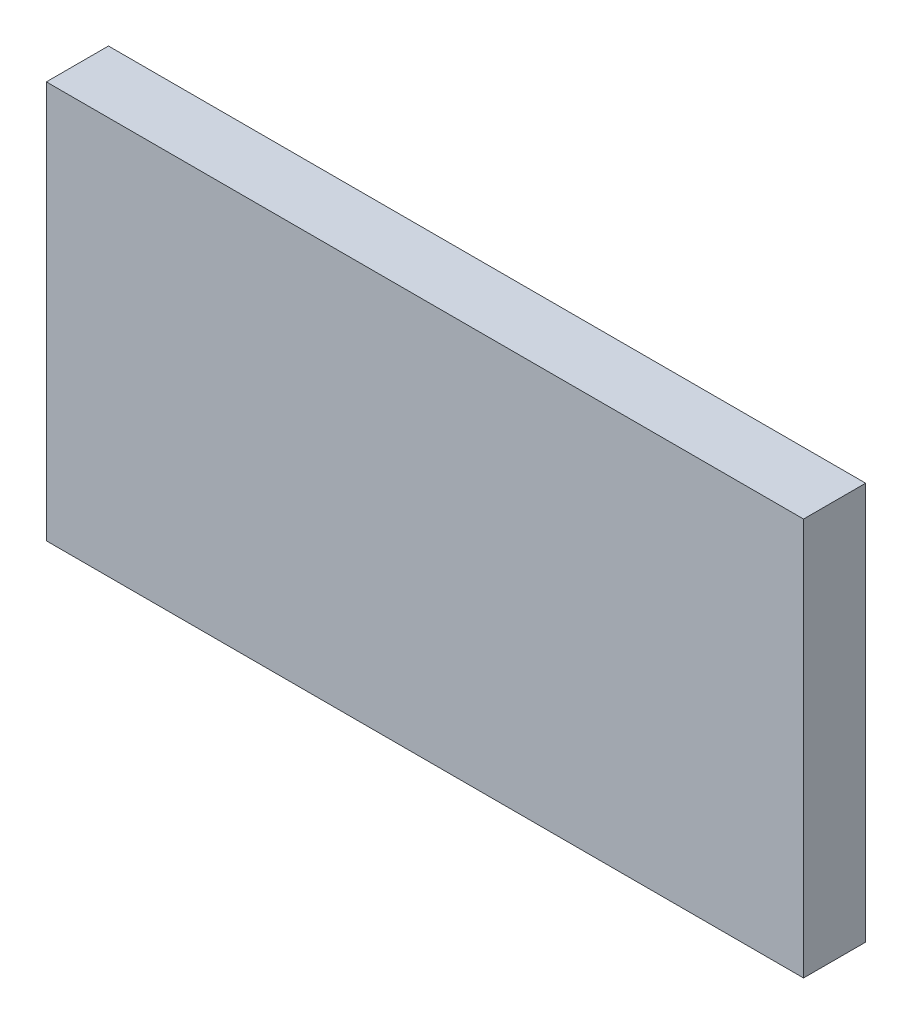
ISO-10303-21;
HEADER;
FILE_DESCRIPTION(('STEP AP214'),'2;1');
FILE_NAME('part.step','',(''),(''),'','','');
FILE_SCHEMA(('AUTOMOTIVE_DESIGN { 1 0 10303 214 1 1 1 1 }'));
ENDSEC;
DATA;
#1=APPLICATION_CONTEXT('core data for automotive mechanical design processes');
#2=APPLICATION_PROTOCOL_DEFINITION('international standard','automotive_design',2000,#1);
#3=PRODUCT_CONTEXT('',#1,'mechanical');
#4=PRODUCT('Part','Part','',(#3));
#5=PRODUCT_RELATED_PRODUCT_CATEGORY('part','',(#4));
#6=PRODUCT_DEFINITION_FORMATION('','',#4);
#7=PRODUCT_DEFINITION_CONTEXT('part definition',#1,'design');
#8=PRODUCT_DEFINITION('design','',#6,#7);
#9=PRODUCT_DEFINITION_SHAPE('','',#8);
#10=(LENGTH_UNIT() NAMED_UNIT(*) SI_UNIT(.MILLI.,.METRE.));
#11=(NAMED_UNIT(*) PLANE_ANGLE_UNIT() SI_UNIT($,.RADIAN.));
#12=(NAMED_UNIT(*) SI_UNIT($,.STERADIAN.) SOLID_ANGLE_UNIT());
#13=UNCERTAINTY_MEASURE_WITH_UNIT(LENGTH_MEASURE(1.E-05),#10,'distance_accuracy_value','');
#14=(GEOMETRIC_REPRESENTATION_CONTEXT(3) GLOBAL_UNCERTAINTY_ASSIGNED_CONTEXT((#13)) GLOBAL_UNIT_ASSIGNED_CONTEXT((#10,
#11,#12)) REPRESENTATION_CONTEXT('',''));
#15=CARTESIAN_POINT('',(0.,0.,0.));
#16=DIRECTION('',(0.,0.,1.));
#17=DIRECTION('',(1.,0.,0.));
#18=AXIS2_PLACEMENT_3D('',#15,#16,#17);
#19=CARTESIAN_POINT('',(60.96,0.,-5.));
#20=DIRECTION('',(0.,-1.,0.));
#21=DIRECTION('',(1.,0.,0.));
#22=AXIS2_PLACEMENT_3D('',#19,#20,#21);
#23=PLANE('',#22);
#24=DIRECTION('',(1.,0.,0.));
#25=VECTOR('',#24,1.);
#26=CARTESIAN_POINT('',(60.96,0.,0.));
#27=LINE('',#26,#25);
#28=CARTESIAN_POINT('',(0.,0.,0.));
#29=VERTEX_POINT('',#28);
#30=CARTESIAN_POINT('',(60.96,0.,0.));
#31=VERTEX_POINT('',#30);
#32=EDGE_CURVE('E109',#29,#31,#27,.T.);
#33=ORIENTED_EDGE('',*,*,#32,.F.);
#34=DIRECTION('',(0.,0.,1.));
#35=VECTOR('',#34,1.);
#36=CARTESIAN_POINT('',(0.,0.,-5.));
#37=LINE('',#36,#35);
#38=CARTESIAN_POINT('',(0.,0.,-5.));
#39=VERTEX_POINT('',#38);
#40=EDGE_CURVE('E11',#39,#29,#37,.T.);
#41=ORIENTED_EDGE('',*,*,#40,.F.);
#42=DIRECTION('',(1.,0.,0.));
#43=VECTOR('',#42,1.);
#44=CARTESIAN_POINT('',(60.96,0.,-5.));
#45=LINE('',#44,#43);
#46=CARTESIAN_POINT('',(60.96,0.,-5.));
#47=VERTEX_POINT('',#46);
#48=EDGE_CURVE('E100',#39,#47,#45,.T.);
#49=ORIENTED_EDGE('',*,*,#48,.T.);
#50=DIRECTION('',(0.,0.,1.));
#51=VECTOR('',#50,1.);
#52=CARTESIAN_POINT('',(60.96,0.,-5.));
#53=LINE('',#52,#51);
#54=EDGE_CURVE('E41',#47,#31,#53,.T.);
#55=ORIENTED_EDGE('',*,*,#54,.T.);
#56=EDGE_LOOP('',(#33,#41,#49,#55));
#57=FACE_BOUND('',#56,.T.);
#58=ADVANCED_FACE('F38',(#57),#23,.T.);
#59=CARTESIAN_POINT('',(0.,0.,-5.));
#60=DIRECTION('',(-1.,0.,0.));
#61=DIRECTION('',(0.,0.,1.));
#62=AXIS2_PLACEMENT_3D('',#59,#60,#61);
#63=PLANE('',#62);
#64=DIRECTION('',(0.,-1.,0.));
#65=VECTOR('',#64,1.);
#66=CARTESIAN_POINT('',(0.,0.,0.));
#67=LINE('',#66,#65);
#68=CARTESIAN_POINT('',(0.,32.,0.));
#69=VERTEX_POINT('',#68);
#70=EDGE_CURVE('E104',#69,#29,#67,.T.);
#71=ORIENTED_EDGE('',*,*,#70,.F.);
#72=DIRECTION('',(0.,0.,1.));
#73=VECTOR('',#72,1.);
#74=CARTESIAN_POINT('',(0.,32.,-5.));
#75=LINE('',#74,#73);
#76=CARTESIAN_POINT('',(0.,32.,-5.));
#77=VERTEX_POINT('',#76);
#78=EDGE_CURVE('E48',#77,#69,#75,.T.);
#79=ORIENTED_EDGE('',*,*,#78,.F.);
#80=DIRECTION('',(0.,-1.,0.));
#81=VECTOR('',#80,1.);
#82=CARTESIAN_POINT('',(0.,0.,-5.));
#83=LINE('',#82,#81);
#84=EDGE_CURVE('E95',#77,#39,#83,.T.);
#85=ORIENTED_EDGE('',*,*,#84,.T.);
#86=ORIENTED_EDGE('',*,*,#40,.T.);
#87=EDGE_LOOP('',(#71,#79,#85,#86));
#88=FACE_BOUND('',#87,.T.);
#89=ADVANCED_FACE('F124',(#88),#63,.T.);
#90=CARTESIAN_POINT('',(0.,32.,-5.));
#91=DIRECTION('',(0.,1.,0.));
#92=DIRECTION('',(0.,0.,1.));
#93=AXIS2_PLACEMENT_3D('',#90,#91,#92);
#94=PLANE('',#93);
#95=DIRECTION('',(-1.,0.,0.));
#96=VECTOR('',#95,1.);
#97=CARTESIAN_POINT('',(0.,32.,0.));
#98=LINE('',#97,#96);
#99=CARTESIAN_POINT('',(60.96,32.,0.));
#100=VERTEX_POINT('',#99);
#101=EDGE_CURVE('E89',#100,#69,#98,.T.);
#102=ORIENTED_EDGE('',*,*,#101,.F.);
#103=DIRECTION('',(0.,0.,1.));
#104=VECTOR('',#103,1.);
#105=CARTESIAN_POINT('',(60.96,32.,-5.));
#106=LINE('',#105,#104);
#107=CARTESIAN_POINT('',(60.96,32.,-5.));
#108=VERTEX_POINT('',#107);
#109=EDGE_CURVE('E84',#108,#100,#106,.T.);
#110=ORIENTED_EDGE('',*,*,#109,.F.);
#111=DIRECTION('',(-1.,0.,0.));
#112=VECTOR('',#111,1.);
#113=CARTESIAN_POINT('',(0.,32.,-5.));
#114=LINE('',#113,#112);
#115=EDGE_CURVE('E87',#108,#77,#114,.T.);
#116=ORIENTED_EDGE('',*,*,#115,.T.);
#117=ORIENTED_EDGE('',*,*,#78,.T.);
#118=EDGE_LOOP('',(#102,#110,#116,#117));
#119=FACE_BOUND('',#118,.T.);
#120=ADVANCED_FACE('F86',(#119),#94,.T.);
#121=CARTESIAN_POINT('',(60.96,32.,-5.));
#122=DIRECTION('',(1.,0.,0.));
#123=DIRECTION('',(0.,1.,0.));
#124=AXIS2_PLACEMENT_3D('',#121,#122,#123);
#125=PLANE('',#124);
#126=DIRECTION('',(0.,1.,0.));
#127=VECTOR('',#126,1.);
#128=CARTESIAN_POINT('',(60.96,32.,0.));
#129=LINE('',#128,#127);
#130=EDGE_CURVE('E113',#31,#100,#129,.T.);
#131=ORIENTED_EDGE('',*,*,#130,.F.);
#132=ORIENTED_EDGE('',*,*,#54,.F.);
#133=DIRECTION('',(0.,1.,0.));
#134=VECTOR('',#133,1.);
#135=CARTESIAN_POINT('',(60.96,32.,-5.));
#136=LINE('',#135,#134);
#137=EDGE_CURVE('E94',#47,#108,#136,.T.);
#138=ORIENTED_EDGE('',*,*,#137,.T.);
#139=ORIENTED_EDGE('',*,*,#109,.T.);
#140=EDGE_LOOP('',(#131,#132,#138,#139));
#141=FACE_BOUND('',#140,.T.);
#142=ADVANCED_FACE('F98',(#141),#125,.T.);
#143=CARTESIAN_POINT('',(0.,0.,-5.));
#144=DIRECTION('',(0.,0.,-1.));
#145=DIRECTION('',(-1.,0.,0.));
#146=AXIS2_PLACEMENT_3D('',#143,#144,#145);
#147=PLANE('',#146);
#148=ORIENTED_EDGE('',*,*,#48,.F.);
#149=ORIENTED_EDGE('',*,*,#84,.F.);
#150=ORIENTED_EDGE('',*,*,#115,.F.);
#151=ORIENTED_EDGE('',*,*,#137,.F.);
#152=EDGE_LOOP('',(#148,#149,#150,#151));
#153=FACE_BOUND('',#152,.T.);
#154=ADVANCED_FACE('F93',(#153),#147,.T.);
#155=CARTESIAN_POINT('',(0.,0.,0.));
#156=DIRECTION('',(0.,0.,-1.));
#157=DIRECTION('',(-1.,0.,0.));
#158=AXIS2_PLACEMENT_3D('',#155,#156,#157);
#159=PLANE('',#158);
#160=ORIENTED_EDGE('',*,*,#32,.T.);
#161=ORIENTED_EDGE('',*,*,#130,.T.);
#162=ORIENTED_EDGE('',*,*,#101,.T.);
#163=ORIENTED_EDGE('',*,*,#70,.T.);
#164=EDGE_LOOP('',(#160,#161,#162,#163));
#165=FACE_BOUND('',#164,.T.);
#166=ADVANCED_FACE('F123',(#165),#159,.F.);
#167=CLOSED_SHELL('',(#58,#89,#120,#142,#154,#166));
#168=MANIFOLD_SOLID_BREP('B2',#167);
#169=ADVANCED_BREP_SHAPE_REPRESENTATION('',(#18,#168),#14);
#170=SHAPE_DEFINITION_REPRESENTATION(#9,#169);
ENDSEC;
END-ISO-10303-21;
